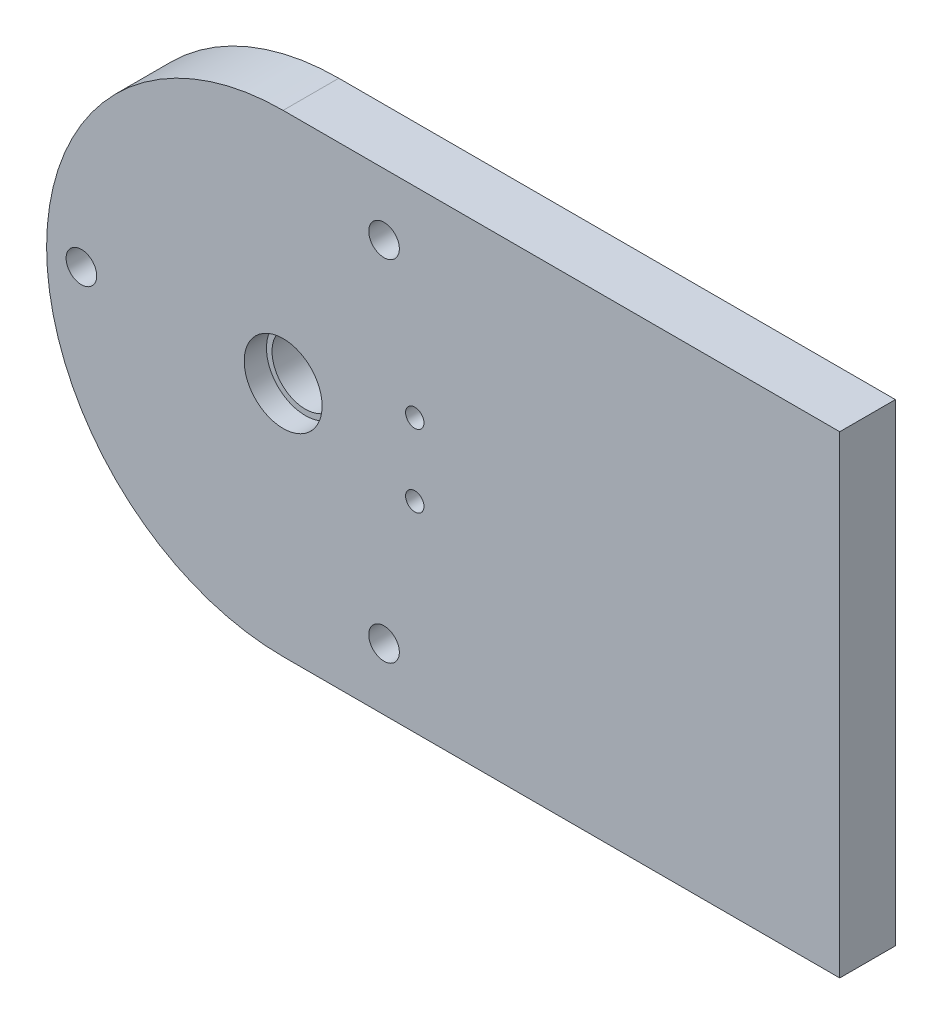
ISO-10303-21;
HEADER;
FILE_DESCRIPTION(('STEP AP214'),'2;1');
FILE_NAME('part.step','',(''),(''),'','','');
FILE_SCHEMA(('AUTOMOTIVE_DESIGN { 1 0 10303 214 1 1 1 1 }'));
ENDSEC;
DATA;
#1=APPLICATION_CONTEXT('core data for automotive mechanical design processes');
#2=APPLICATION_PROTOCOL_DEFINITION('international standard','automotive_design',2000,#1);
#3=PRODUCT_CONTEXT('',#1,'mechanical');
#4=PRODUCT('Part','Part','',(#3));
#5=PRODUCT_RELATED_PRODUCT_CATEGORY('part','',(#4));
#6=PRODUCT_DEFINITION_FORMATION('','',#4);
#7=PRODUCT_DEFINITION_CONTEXT('part definition',#1,'design');
#8=PRODUCT_DEFINITION('design','',#6,#7);
#9=PRODUCT_DEFINITION_SHAPE('','',#8);
#10=(LENGTH_UNIT() NAMED_UNIT(*) SI_UNIT(.MILLI.,.METRE.));
#11=(NAMED_UNIT(*) PLANE_ANGLE_UNIT() SI_UNIT($,.RADIAN.));
#12=(NAMED_UNIT(*) SI_UNIT($,.STERADIAN.) SOLID_ANGLE_UNIT());
#13=UNCERTAINTY_MEASURE_WITH_UNIT(LENGTH_MEASURE(1.E-05),#10,'distance_accuracy_value','');
#14=(GEOMETRIC_REPRESENTATION_CONTEXT(3) GLOBAL_UNCERTAINTY_ASSIGNED_CONTEXT((#13)) GLOBAL_UNIT_ASSIGNED_CONTEXT((#10,
#11,#12)) REPRESENTATION_CONTEXT('',''));
#15=CARTESIAN_POINT('',(0.,0.,0.));
#16=DIRECTION('',(0.,0.,1.));
#17=DIRECTION('',(1.,0.,0.));
#18=AXIS2_PLACEMENT_3D('',#15,#16,#17);
#19=CARTESIAN_POINT('',(0.,0.,20.));
#20=DIRECTION('',(0.,0.,-1.));
#21=DIRECTION('',(-1.,0.,0.));
#22=AXIS2_PLACEMENT_3D('',#19,#20,#21);
#23=CYLINDRICAL_SURFACE('',#22,85.);
#24=CARTESIAN_POINT('',(0.,0.,0.));
#25=DIRECTION('',(0.,0.,1.));
#26=DIRECTION('',(1.,0.,0.));
#27=AXIS2_PLACEMENT_3D('',#24,#25,#26);
#28=CIRCLE('',#27,85.);
#29=CARTESIAN_POINT('',(0.,85.,0.));
#30=VERTEX_POINT('',#29);
#31=CARTESIAN_POINT('',(0.,-85.,0.));
#32=VERTEX_POINT('',#31);
#33=EDGE_CURVE('E98',#30,#32,#28,.T.);
#34=ORIENTED_EDGE('',*,*,#33,.T.);
#35=DIRECTION('',(0.,0.,-1.));
#36=VECTOR('',#35,1.);
#37=CARTESIAN_POINT('',(0.,-85.,20.));
#38=LINE('',#37,#36);
#39=CARTESIAN_POINT('',(0.,-85.,20.));
#40=VERTEX_POINT('',#39);
#41=EDGE_CURVE('E11',#40,#32,#38,.T.);
#42=ORIENTED_EDGE('',*,*,#41,.F.);
#43=CARTESIAN_POINT('',(0.,0.,20.));
#44=DIRECTION('',(0.,0.,1.));
#45=DIRECTION('',(1.,0.,0.));
#46=AXIS2_PLACEMENT_3D('',#43,#44,#45);
#47=CIRCLE('',#46,85.);
#48=CARTESIAN_POINT('',(0.,85.,20.));
#49=VERTEX_POINT('',#48);
#50=EDGE_CURVE('E86',#49,#40,#47,.T.);
#51=ORIENTED_EDGE('',*,*,#50,.F.);
#52=DIRECTION('',(0.,0.,-1.));
#53=VECTOR('',#52,1.);
#54=CARTESIAN_POINT('',(0.,85.,20.));
#55=LINE('',#54,#53);
#56=EDGE_CURVE('E94',#49,#30,#55,.T.);
#57=ORIENTED_EDGE('',*,*,#56,.T.);
#58=EDGE_LOOP('',(#34,#42,#51,#57));
#59=FACE_BOUND('',#58,.T.);
#60=ADVANCED_FACE('F35',(#59),#23,.T.);
#61=CARTESIAN_POINT('',(200.,-85.,20.));
#62=DIRECTION('',(0.,1.,0.));
#63=DIRECTION('',(-1.,0.,0.));
#64=AXIS2_PLACEMENT_3D('',#61,#62,#63);
#65=PLANE('',#64);
#66=DIRECTION('',(1.,0.,0.));
#67=VECTOR('',#66,1.);
#68=CARTESIAN_POINT('',(200.,-85.,0.));
#69=LINE('',#68,#67);
#70=CARTESIAN_POINT('',(200.,-85.,0.));
#71=VERTEX_POINT('',#70);
#72=EDGE_CURVE('E90',#32,#71,#69,.T.);
#73=ORIENTED_EDGE('',*,*,#72,.T.);
#74=DIRECTION('',(0.,0.,-1.));
#75=VECTOR('',#74,1.);
#76=CARTESIAN_POINT('',(200.,-85.,20.));
#77=LINE('',#76,#75);
#78=CARTESIAN_POINT('',(200.,-85.,20.));
#79=VERTEX_POINT('',#78);
#80=EDGE_CURVE('E43',#79,#71,#77,.T.);
#81=ORIENTED_EDGE('',*,*,#80,.F.);
#82=DIRECTION('',(1.,0.,0.));
#83=VECTOR('',#82,1.);
#84=CARTESIAN_POINT('',(200.,-85.,20.));
#85=LINE('',#84,#83);
#86=EDGE_CURVE('E81',#40,#79,#85,.T.);
#87=ORIENTED_EDGE('',*,*,#86,.F.);
#88=ORIENTED_EDGE('',*,*,#41,.T.);
#89=EDGE_LOOP('',(#73,#81,#87,#88));
#90=FACE_BOUND('',#89,.T.);
#91=ADVANCED_FACE('F89',(#90),#65,.F.);
#92=CARTESIAN_POINT('',(200.,85.,20.));
#93=DIRECTION('',(-1.,0.,0.));
#94=DIRECTION('',(0.,0.,1.));
#95=AXIS2_PLACEMENT_3D('',#92,#93,#94);
#96=PLANE('',#95);
#97=DIRECTION('',(0.,1.,0.));
#98=VECTOR('',#97,1.);
#99=CARTESIAN_POINT('',(200.,85.,0.));
#100=LINE('',#99,#98);
#101=CARTESIAN_POINT('',(200.,85.,0.));
#102=VERTEX_POINT('',#101);
#103=EDGE_CURVE('E68',#71,#102,#100,.T.);
#104=ORIENTED_EDGE('',*,*,#103,.T.);
#105=DIRECTION('',(0.,0.,-1.));
#106=VECTOR('',#105,1.);
#107=CARTESIAN_POINT('',(200.,85.,20.));
#108=LINE('',#107,#106);
#109=CARTESIAN_POINT('',(200.,85.,20.));
#110=VERTEX_POINT('',#109);
#111=EDGE_CURVE('E91',#110,#102,#108,.T.);
#112=ORIENTED_EDGE('',*,*,#111,.F.);
#113=DIRECTION('',(0.,1.,0.));
#114=VECTOR('',#113,1.);
#115=CARTESIAN_POINT('',(200.,85.,20.));
#116=LINE('',#115,#114);
#117=EDGE_CURVE('E84',#79,#110,#116,.T.);
#118=ORIENTED_EDGE('',*,*,#117,.F.);
#119=ORIENTED_EDGE('',*,*,#80,.T.);
#120=EDGE_LOOP('',(#104,#112,#118,#119));
#121=FACE_BOUND('',#120,.T.);
#122=ADVANCED_FACE('F92',(#121),#96,.F.);
#123=CARTESIAN_POINT('',(0.,85.,20.));
#124=DIRECTION('',(0.,-1.,0.));
#125=DIRECTION('',(1.,0.,0.));
#126=AXIS2_PLACEMENT_3D('',#123,#124,#125);
#127=PLANE('',#126);
#128=DIRECTION('',(-1.,0.,0.));
#129=VECTOR('',#128,1.);
#130=CARTESIAN_POINT('',(0.,85.,0.));
#131=LINE('',#130,#129);
#132=EDGE_CURVE('E74',#102,#30,#131,.T.);
#133=ORIENTED_EDGE('',*,*,#132,.T.);
#134=ORIENTED_EDGE('',*,*,#56,.F.);
#135=DIRECTION('',(-1.,0.,0.));
#136=VECTOR('',#135,1.);
#137=CARTESIAN_POINT('',(0.,85.,20.));
#138=LINE('',#137,#136);
#139=EDGE_CURVE('E51',#110,#49,#138,.T.);
#140=ORIENTED_EDGE('',*,*,#139,.F.);
#141=ORIENTED_EDGE('',*,*,#111,.T.);
#142=EDGE_LOOP('',(#133,#134,#140,#141));
#143=FACE_BOUND('',#142,.T.);
#144=ADVANCED_FACE('F106',(#143),#127,.F.);
#145=CARTESIAN_POINT('',(0.,0.,20.));
#146=DIRECTION('',(0.,0.,1.));
#147=DIRECTION('',(1.,0.,0.));
#148=AXIS2_PLACEMENT_3D('',#145,#146,#147);
#149=PLANE('',#148);
#150=CARTESIAN_POINT('',(47.3,13.,20.));
#151=DIRECTION('',(0.,0.,1.));
#152=DIRECTION('',(1.,0.,0.));
#153=AXIS2_PLACEMENT_3D('',#150,#151,#152);
#154=CIRCLE('',#153,3.29999999999999);
#155=CARTESIAN_POINT('',(50.6,13.,20.));
#156=VERTEX_POINT('',#155);
#157=EDGE_CURVE('E148',#156,#156,#154,.T.);
#158=ORIENTED_EDGE('',*,*,#157,.F.);
#159=EDGE_LOOP('',(#158));
#160=FACE_BOUND('',#159,.T.);
#161=CARTESIAN_POINT('',(47.3,-13.,20.));
#162=DIRECTION('',(0.,0.,1.));
#163=DIRECTION('',(1.,0.,0.));
#164=AXIS2_PLACEMENT_3D('',#161,#162,#163);
#165=CIRCLE('',#164,3.3);
#166=CARTESIAN_POINT('',(50.6,-13.,20.));
#167=VERTEX_POINT('',#166);
#168=EDGE_CURVE('E142',#167,#167,#165,.T.);
#169=ORIENTED_EDGE('',*,*,#168,.F.);
#170=EDGE_LOOP('',(#169));
#171=FACE_BOUND('',#170,.T.);
#172=CARTESIAN_POINT('',(-72.5,0.,20.));
#173=DIRECTION('',(0.,0.,1.));
#174=DIRECTION('',(1.,0.,0.));
#175=AXIS2_PLACEMENT_3D('',#172,#173,#174);
#176=CIRCLE('',#175,5.5);
#177=CARTESIAN_POINT('',(-67.,0.,20.));
#178=VERTEX_POINT('',#177);
#179=EDGE_CURVE('E137',#178,#178,#176,.T.);
#180=ORIENTED_EDGE('',*,*,#179,.F.);
#181=EDGE_LOOP('',(#180));
#182=FACE_BOUND('',#181,.T.);
#183=CARTESIAN_POINT('',(36.2500000000003,62.7868417743716,20.));
#184=DIRECTION('',(0.,0.,1.));
#185=DIRECTION('',(1.,0.,0.));
#186=AXIS2_PLACEMENT_3D('',#183,#184,#185);
#187=CIRCLE('',#186,5.50000000000001);
#188=CARTESIAN_POINT('',(41.7500000000003,62.7868417743716,20.));
#189=VERTEX_POINT('',#188);
#190=EDGE_CURVE('E131',#189,#189,#187,.T.);
#191=ORIENTED_EDGE('',*,*,#190,.F.);
#192=EDGE_LOOP('',(#191));
#193=FACE_BOUND('',#192,.T.);
#194=CARTESIAN_POINT('',(36.2499999999994,-62.7868417743722,20.));
#195=DIRECTION('',(0.,0.,1.));
#196=DIRECTION('',(1.,0.,0.));
#197=AXIS2_PLACEMENT_3D('',#194,#195,#196);
#198=CIRCLE('',#197,5.50000000000001);
#199=CARTESIAN_POINT('',(41.7499999999994,-62.7868417743722,20.));
#200=VERTEX_POINT('',#199);
#201=EDGE_CURVE('E124',#200,#200,#198,.T.);
#202=ORIENTED_EDGE('',*,*,#201,.F.);
#203=EDGE_LOOP('',(#202));
#204=FACE_BOUND('',#203,.T.);
#205=CARTESIAN_POINT('',(0.,0.,20.));
#206=DIRECTION('',(0.,0.,1.));
#207=DIRECTION('',(1.,0.,0.));
#208=AXIS2_PLACEMENT_3D('',#205,#206,#207);
#209=CIRCLE('',#208,14.);
#210=CARTESIAN_POINT('',(14.,0.,20.));
#211=VERTEX_POINT('',#210);
#212=EDGE_CURVE('E112',#211,#211,#209,.T.);
#213=ORIENTED_EDGE('',*,*,#212,.F.);
#214=EDGE_LOOP('',(#213));
#215=FACE_BOUND('',#214,.T.);
#216=ORIENTED_EDGE('',*,*,#50,.T.);
#217=ORIENTED_EDGE('',*,*,#86,.T.);
#218=ORIENTED_EDGE('',*,*,#117,.T.);
#219=ORIENTED_EDGE('',*,*,#139,.T.);
#220=EDGE_LOOP('',(#216,#217,#218,#219));
#221=FACE_BOUND('',#220,.T.);
#222=ADVANCED_FACE('F82',(#160,#171,#182,#193,#204,#215,#221),#149,.T.);
#223=CARTESIAN_POINT('',(0.,0.,0.));
#224=DIRECTION('',(0.,0.,1.));
#225=DIRECTION('',(1.,0.,0.));
#226=AXIS2_PLACEMENT_3D('',#223,#224,#225);
#227=PLANE('',#226);
#228=CARTESIAN_POINT('',(47.3,13.,0.));
#229=DIRECTION('',(0.,0.,1.));
#230=DIRECTION('',(1.,0.,0.));
#231=AXIS2_PLACEMENT_3D('',#228,#229,#230);
#232=CIRCLE('',#231,3.29999999999999);
#233=CARTESIAN_POINT('',(50.6,13.,0.));
#234=VERTEX_POINT('',#233);
#235=EDGE_CURVE('E128',#234,#234,#232,.T.);
#236=ORIENTED_EDGE('',*,*,#235,.T.);
#237=EDGE_LOOP('',(#236));
#238=FACE_BOUND('',#237,.T.);
#239=CARTESIAN_POINT('',(47.3,-13.,0.));
#240=DIRECTION('',(0.,0.,1.));
#241=DIRECTION('',(1.,0.,0.));
#242=AXIS2_PLACEMENT_3D('',#239,#240,#241);
#243=CIRCLE('',#242,3.3);
#244=CARTESIAN_POINT('',(50.6,-13.,0.));
#245=VERTEX_POINT('',#244);
#246=EDGE_CURVE('E145',#245,#245,#243,.T.);
#247=ORIENTED_EDGE('',*,*,#246,.T.);
#248=EDGE_LOOP('',(#247));
#249=FACE_BOUND('',#248,.T.);
#250=CARTESIAN_POINT('',(-72.5,0.,0.));
#251=DIRECTION('',(0.,0.,1.));
#252=DIRECTION('',(1.,0.,0.));
#253=AXIS2_PLACEMENT_3D('',#250,#251,#252);
#254=CIRCLE('',#253,5.5);
#255=CARTESIAN_POINT('',(-67.,0.,0.));
#256=VERTEX_POINT('',#255);
#257=EDGE_CURVE('E121',#256,#256,#254,.T.);
#258=ORIENTED_EDGE('',*,*,#257,.T.);
#259=EDGE_LOOP('',(#258));
#260=FACE_BOUND('',#259,.T.);
#261=CARTESIAN_POINT('',(36.2500000000003,62.7868417743716,0.));
#262=DIRECTION('',(0.,0.,1.));
#263=DIRECTION('',(1.,0.,0.));
#264=AXIS2_PLACEMENT_3D('',#261,#262,#263);
#265=CIRCLE('',#264,5.50000000000001);
#266=CARTESIAN_POINT('',(41.7500000000003,62.7868417743716,0.));
#267=VERTEX_POINT('',#266);
#268=EDGE_CURVE('E134',#267,#267,#265,.T.);
#269=ORIENTED_EDGE('',*,*,#268,.T.);
#270=EDGE_LOOP('',(#269));
#271=FACE_BOUND('',#270,.T.);
#272=CARTESIAN_POINT('',(36.2499999999994,-62.7868417743722,0.));
#273=DIRECTION('',(0.,0.,1.));
#274=DIRECTION('',(1.,0.,0.));
#275=AXIS2_PLACEMENT_3D('',#272,#273,#274);
#276=CIRCLE('',#275,5.50000000000001);
#277=CARTESIAN_POINT('',(41.7499999999994,-62.7868417743722,0.));
#278=VERTEX_POINT('',#277);
#279=EDGE_CURVE('E127',#278,#278,#276,.T.);
#280=ORIENTED_EDGE('',*,*,#279,.T.);
#281=EDGE_LOOP('',(#280));
#282=FACE_BOUND('',#281,.T.);
#283=CARTESIAN_POINT('',(0.,0.,0.));
#284=DIRECTION('',(0.,0.,1.));
#285=DIRECTION('',(1.,0.,0.));
#286=AXIS2_PLACEMENT_3D('',#283,#284,#285);
#287=CIRCLE('',#286,12.);
#288=CARTESIAN_POINT('',(12.,0.,0.));
#289=VERTEX_POINT('',#288);
#290=EDGE_CURVE('E115',#289,#289,#287,.T.);
#291=ORIENTED_EDGE('',*,*,#290,.T.);
#292=EDGE_LOOP('',(#291));
#293=FACE_BOUND('',#292,.T.);
#294=ORIENTED_EDGE('',*,*,#33,.F.);
#295=ORIENTED_EDGE('',*,*,#132,.F.);
#296=ORIENTED_EDGE('',*,*,#103,.F.);
#297=ORIENTED_EDGE('',*,*,#72,.F.);
#298=EDGE_LOOP('',(#294,#295,#296,#297));
#299=FACE_BOUND('',#298,.T.);
#300=ADVANCED_FACE('F109',(#238,#249,#260,#271,#282,#293,#299),#227,.F.);
#301=CARTESIAN_POINT('',(0.,0.,12.));
#302=DIRECTION('',(0.,0.,1.));
#303=DIRECTION('',(1.,0.,0.));
#304=AXIS2_PLACEMENT_3D('',#301,#302,#303);
#305=CYLINDRICAL_SURFACE('',#304,14.);
#306=CARTESIAN_POINT('',(0.,0.,12.));
#307=DIRECTION('',(0.,0.,1.));
#308=DIRECTION('',(1.,0.,0.));
#309=AXIS2_PLACEMENT_3D('',#306,#307,#308);
#310=CIRCLE('',#309,14.);
#311=CARTESIAN_POINT('',(14.,0.,12.));
#312=VERTEX_POINT('',#311);
#313=EDGE_CURVE('E101',#312,#312,#310,.T.);
#314=ORIENTED_EDGE('',*,*,#313,.F.);
#315=EDGE_LOOP('',(#314));
#316=FACE_BOUND('',#315,.T.);
#317=ORIENTED_EDGE('',*,*,#212,.T.);
#318=EDGE_LOOP('',(#317));
#319=FACE_BOUND('',#318,.T.);
#320=ADVANCED_FACE('F176',(#316,#319),#305,.F.);
#321=CARTESIAN_POINT('',(0.,0.,12.));
#322=DIRECTION('',(0.,0.,1.));
#323=DIRECTION('',(1.,0.,0.));
#324=AXIS2_PLACEMENT_3D('',#321,#322,#323);
#325=PLANE('',#324);
#326=CARTESIAN_POINT('',(0.,0.,12.));
#327=DIRECTION('',(0.,0.,1.));
#328=DIRECTION('',(1.,0.,0.));
#329=AXIS2_PLACEMENT_3D('',#326,#327,#328);
#330=CIRCLE('',#329,12.);
#331=CARTESIAN_POINT('',(12.,0.,12.));
#332=VERTEX_POINT('',#331);
#333=EDGE_CURVE('E118',#332,#332,#330,.T.);
#334=ORIENTED_EDGE('',*,*,#333,.F.);
#335=EDGE_LOOP('',(#334));
#336=FACE_BOUND('',#335,.T.);
#337=ORIENTED_EDGE('',*,*,#313,.T.);
#338=EDGE_LOOP('',(#337));
#339=FACE_BOUND('',#338,.T.);
#340=ADVANCED_FACE('F178',(#336,#339),#325,.T.);
#341=CARTESIAN_POINT('',(0.,0.,0.));
#342=DIRECTION('',(0.,0.,1.));
#343=DIRECTION('',(1.,0.,0.));
#344=AXIS2_PLACEMENT_3D('',#341,#342,#343);
#345=CYLINDRICAL_SURFACE('',#344,12.);
#346=ORIENTED_EDGE('',*,*,#290,.F.);
#347=EDGE_LOOP('',(#346));
#348=FACE_BOUND('',#347,.T.);
#349=ORIENTED_EDGE('',*,*,#333,.T.);
#350=EDGE_LOOP('',(#349));
#351=FACE_BOUND('',#350,.T.);
#352=ADVANCED_FACE('F185',(#348,#351),#345,.F.);
#353=CARTESIAN_POINT('',(36.2499999999994,-62.7868417743722,0.));
#354=DIRECTION('',(0.,0.,1.));
#355=DIRECTION('',(1.,0.,0.));
#356=AXIS2_PLACEMENT_3D('',#353,#354,#355);
#357=CYLINDRICAL_SURFACE('',#356,5.50000000000001);
#358=ORIENTED_EDGE('',*,*,#279,.F.);
#359=EDGE_LOOP('',(#358));
#360=FACE_BOUND('',#359,.T.);
#361=ORIENTED_EDGE('',*,*,#201,.T.);
#362=EDGE_LOOP('',(#361));
#363=FACE_BOUND('',#362,.T.);
#364=ADVANCED_FACE('F245',(#360,#363),#357,.F.);
#365=CARTESIAN_POINT('',(36.2500000000003,62.7868417743716,0.));
#366=DIRECTION('',(0.,0.,1.));
#367=DIRECTION('',(1.,0.,0.));
#368=AXIS2_PLACEMENT_3D('',#365,#366,#367);
#369=CYLINDRICAL_SURFACE('',#368,5.50000000000001);
#370=ORIENTED_EDGE('',*,*,#268,.F.);
#371=EDGE_LOOP('',(#370));
#372=FACE_BOUND('',#371,.T.);
#373=ORIENTED_EDGE('',*,*,#190,.T.);
#374=EDGE_LOOP('',(#373));
#375=FACE_BOUND('',#374,.T.);
#376=ADVANCED_FACE('F238',(#372,#375),#369,.F.);
#377=CARTESIAN_POINT('',(-72.5,0.,0.));
#378=DIRECTION('',(0.,0.,1.));
#379=DIRECTION('',(1.,0.,0.));
#380=AXIS2_PLACEMENT_3D('',#377,#378,#379);
#381=CYLINDRICAL_SURFACE('',#380,5.5);
#382=ORIENTED_EDGE('',*,*,#257,.F.);
#383=EDGE_LOOP('',(#382));
#384=FACE_BOUND('',#383,.T.);
#385=ORIENTED_EDGE('',*,*,#179,.T.);
#386=EDGE_LOOP('',(#385));
#387=FACE_BOUND('',#386,.T.);
#388=ADVANCED_FACE('F223',(#384,#387),#381,.F.);
#389=CARTESIAN_POINT('',(47.3,-13.,0.));
#390=DIRECTION('',(0.,0.,1.));
#391=DIRECTION('',(1.,0.,0.));
#392=AXIS2_PLACEMENT_3D('',#389,#390,#391);
#393=CYLINDRICAL_SURFACE('',#392,3.3);
#394=ORIENTED_EDGE('',*,*,#246,.F.);
#395=EDGE_LOOP('',(#394));
#396=FACE_BOUND('',#395,.T.);
#397=ORIENTED_EDGE('',*,*,#168,.T.);
#398=EDGE_LOOP('',(#397));
#399=FACE_BOUND('',#398,.T.);
#400=ADVANCED_FACE('F159',(#396,#399),#393,.F.);
#401=CARTESIAN_POINT('',(47.3,13.,0.));
#402=DIRECTION('',(0.,0.,1.));
#403=DIRECTION('',(1.,0.,0.));
#404=AXIS2_PLACEMENT_3D('',#401,#402,#403);
#405=CYLINDRICAL_SURFACE('',#404,3.29999999999999);
#406=ORIENTED_EDGE('',*,*,#235,.F.);
#407=EDGE_LOOP('',(#406));
#408=FACE_BOUND('',#407,.T.);
#409=ORIENTED_EDGE('',*,*,#157,.T.);
#410=EDGE_LOOP('',(#409));
#411=FACE_BOUND('',#410,.T.);
#412=ADVANCED_FACE('F156',(#408,#411),#405,.F.);
#413=CLOSED_SHELL('',(#60,#91,#122,#144,#222,#300,#320,#340,#352,#364,#376,#388,#400,#412));
#414=MANIFOLD_SOLID_BREP('B2',#413);
#415=ADVANCED_BREP_SHAPE_REPRESENTATION('',(#18,#414),#14);
#416=SHAPE_DEFINITION_REPRESENTATION(#9,#415);
ENDSEC;
END-ISO-10303-21;
